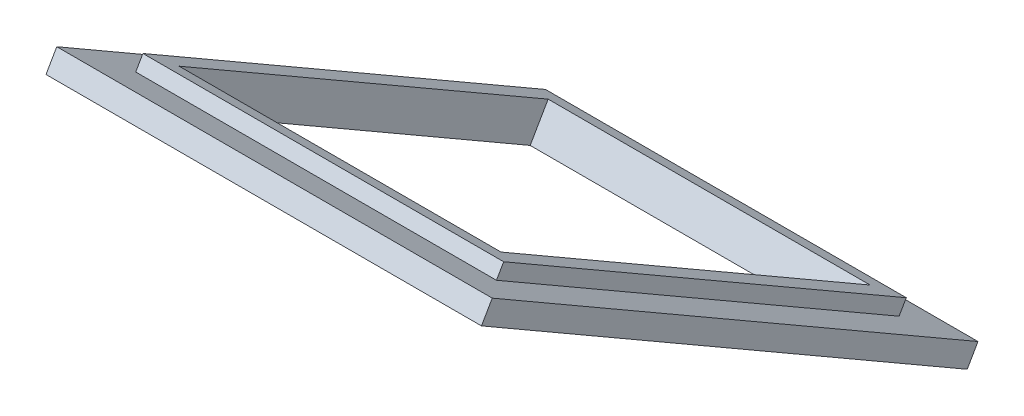
ISO-10303-21;
HEADER;
FILE_DESCRIPTION(('STEP AP214'),'2;1');
FILE_NAME('part.step','',(''),(''),'','','');
FILE_SCHEMA(('AUTOMOTIVE_DESIGN { 1 0 10303 214 1 1 1 1 }'));
ENDSEC;
DATA;
#1=APPLICATION_CONTEXT('core data for automotive mechanical design processes');
#2=APPLICATION_PROTOCOL_DEFINITION('international standard','automotive_design',2000,#1);
#3=PRODUCT_CONTEXT('',#1,'mechanical');
#4=PRODUCT('Part','Part','',(#3));
#5=PRODUCT_RELATED_PRODUCT_CATEGORY('part','',(#4));
#6=PRODUCT_DEFINITION_FORMATION('','',#4);
#7=PRODUCT_DEFINITION_CONTEXT('part definition',#1,'design');
#8=PRODUCT_DEFINITION('design','',#6,#7);
#9=PRODUCT_DEFINITION_SHAPE('','',#8);
#10=(LENGTH_UNIT() NAMED_UNIT(*) SI_UNIT(.MILLI.,.METRE.));
#11=(NAMED_UNIT(*) PLANE_ANGLE_UNIT() SI_UNIT($,.RADIAN.));
#12=(NAMED_UNIT(*) SI_UNIT($,.STERADIAN.) SOLID_ANGLE_UNIT());
#13=UNCERTAINTY_MEASURE_WITH_UNIT(LENGTH_MEASURE(1.E-05),#10,'distance_accuracy_value','');
#14=(GEOMETRIC_REPRESENTATION_CONTEXT(3) GLOBAL_UNCERTAINTY_ASSIGNED_CONTEXT((#13)) GLOBAL_UNIT_ASSIGNED_CONTEXT((#10,
#11,#12)) REPRESENTATION_CONTEXT('',''));
#15=CARTESIAN_POINT('',(0.,0.,0.));
#16=DIRECTION('',(0.,0.,1.));
#17=DIRECTION('',(1.,0.,0.));
#18=AXIS2_PLACEMENT_3D('',#15,#16,#17);
#19=CARTESIAN_POINT('',(0.,-68.9687673215294,39.8191363787617));
#20=DIRECTION('',(0.,0.866025403784439,-0.5));
#21=DIRECTION('',(0.,0.5,0.866025403784439));
#22=AXIS2_PLACEMENT_3D('',#19,#20,#21);
#23=PLANE('',#22);
#24=DIRECTION('',(0.,0.5,0.866025403784439));
#25=VECTOR('',#24,1.);
#26=CARTESIAN_POINT('',(-38.1077910617727,-84.9554244531497,12.129433983612));
#27=LINE('',#26,#25);
#28=CARTESIAN_POINT('',(-38.1077910617727,-84.9554244531497,12.129433983612));
#29=VERTEX_POINT('',#28);
#30=CARTESIAN_POINT('',(-38.1077910617727,-45.926490372918,79.7295307758299));
#31=VERTEX_POINT('',#30);
#32=EDGE_CURVE('E141',#29,#31,#27,.T.);
#33=ORIENTED_EDGE('',*,*,#32,.T.);
#34=DIRECTION('',(1.,0.,0.));
#35=VECTOR('',#34,1.);
#36=CARTESIAN_POINT('',(-38.1077910617727,-45.926490372918,79.7295307758299));
#37=LINE('',#36,#35);
#38=CARTESIAN_POINT('',(22.4922089385485,-45.926490372918,79.7295307758299));
#39=VERTEX_POINT('',#38);
#40=EDGE_CURVE('E218',#31,#39,#37,.T.);
#41=ORIENTED_EDGE('',*,*,#40,.T.);
#42=DIRECTION('',(0.,-0.5,-0.866025403784439));
#43=VECTOR('',#42,1.);
#44=CARTESIAN_POINT('',(22.4922089385485,-45.926490372918,79.7295307758299));
#45=LINE('',#44,#43);
#46=CARTESIAN_POINT('',(22.4922089385485,-84.9554244531497,12.129433983612));
#47=VERTEX_POINT('',#46);
#48=EDGE_CURVE('E221',#39,#47,#45,.T.);
#49=ORIENTED_EDGE('',*,*,#48,.T.);
#50=DIRECTION('',(-1.,0.,0.));
#51=VECTOR('',#50,1.);
#52=CARTESIAN_POINT('',(22.4922089385485,-84.9554244531497,12.129433983612));
#53=LINE('',#52,#51);
#54=EDGE_CURVE('E207',#47,#29,#53,.T.);
#55=ORIENTED_EDGE('',*,*,#54,.T.);
#56=EDGE_LOOP('',(#33,#41,#49,#55));
#57=FACE_BOUND('',#56,.T.);
#58=DIRECTION('',(0.,0.5,0.866025403784439));
#59=VECTOR('',#58,1.);
#60=CARTESIAN_POINT('',(-32.9077910617727,-81.6178178596893,17.9103381791625));
#61=LINE('',#60,#59);
#62=CARTESIAN_POINT('',(-32.9077910617727,-81.6178178596893,17.9103381791624));
#63=VERTEX_POINT('',#62);
#64=CARTESIAN_POINT('',(-32.9077910617727,-49.2678178596937,73.9421818040079));
#65=VERTEX_POINT('',#64);
#66=EDGE_CURVE('E174',#63,#65,#61,.T.);
#67=ORIENTED_EDGE('',*,*,#66,.F.);
#68=DIRECTION('',(-1.,0.,0.));
#69=VECTOR('',#68,1.);
#70=CARTESIAN_POINT('',(-32.9077910617727,-81.6178178596893,17.9103381791625));
#71=LINE('',#70,#69);
#72=CARTESIAN_POINT('',(17.2922089385485,-81.6178178596893,17.9103381791625));
#73=VERTEX_POINT('',#72);
#74=EDGE_CURVE('E58',#73,#63,#71,.T.);
#75=ORIENTED_EDGE('',*,*,#74,.F.);
#76=DIRECTION('',(0.,-0.5,-0.866025403784439));
#77=VECTOR('',#76,1.);
#78=CARTESIAN_POINT('',(17.2922089385485,-81.6178178596893,17.9103381791625));
#79=LINE('',#78,#77);
#80=CARTESIAN_POINT('',(17.2922089385485,-49.2678178596937,73.9421818040079));
#81=VERTEX_POINT('',#80);
#82=EDGE_CURVE('E180',#81,#73,#79,.T.);
#83=ORIENTED_EDGE('',*,*,#82,.F.);
#84=DIRECTION('',(1.,0.,0.));
#85=VECTOR('',#84,1.);
#86=CARTESIAN_POINT('',(-32.9077910617727,-49.2678178596937,73.9421818040079));
#87=LINE('',#86,#85);
#88=EDGE_CURVE('E177',#65,#81,#87,.T.);
#89=ORIENTED_EDGE('',*,*,#88,.F.);
#90=EDGE_LOOP('',(#67,#75,#83,#89));
#91=FACE_BOUND('',#90,.T.);
#92=ADVANCED_FACE('F41',(#57,#91),#23,.T.);
#93=CARTESIAN_POINT('',(-38.1077910617727,-87.5535006645029,13.6294339836119));
#94=DIRECTION('',(-1.,0.,0.));
#95=DIRECTION('',(0.,-1.,0.));
#96=AXIS2_PLACEMENT_3D('',#93,#94,#95);
#97=PLANE('',#96);
#98=ORIENTED_EDGE('',*,*,#32,.F.);
#99=DIRECTION('',(0.,0.866025403784439,-0.5));
#100=VECTOR('',#99,1.);
#101=CARTESIAN_POINT('',(-38.1077910617727,-87.5535006645029,13.6294339836119));
#102=LINE('',#101,#100);
#103=CARTESIAN_POINT('',(-38.1077910617727,-87.5535006645029,13.6294339836119));
#104=VERTEX_POINT('',#103);
#105=EDGE_CURVE('E11',#104,#29,#102,.T.);
#106=ORIENTED_EDGE('',*,*,#105,.F.);
#107=DIRECTION('',(0.,0.5,0.866025403784439));
#108=VECTOR('',#107,1.);
#109=CARTESIAN_POINT('',(-38.1077910617727,-87.5535006645029,13.6294339836119));
#110=LINE('',#109,#108);
#111=CARTESIAN_POINT('',(-38.1077910617727,-48.5245665842711,81.2295307758298));
#112=VERTEX_POINT('',#111);
#113=EDGE_CURVE('E203',#104,#112,#110,.T.);
#114=ORIENTED_EDGE('',*,*,#113,.T.);
#115=DIRECTION('',(0.,0.866025403784439,-0.5));
#116=VECTOR('',#115,1.);
#117=CARTESIAN_POINT('',(-38.1077910617727,-48.5245665842711,81.2295307758298));
#118=LINE('',#117,#116);
#119=EDGE_CURVE('E45',#112,#31,#118,.T.);
#120=ORIENTED_EDGE('',*,*,#119,.T.);
#121=EDGE_LOOP('',(#98,#106,#114,#120));
#122=FACE_BOUND('',#121,.T.);
#123=ADVANCED_FACE('F43',(#122),#97,.T.);
#124=CARTESIAN_POINT('',(22.4922089385485,-87.5535006645029,13.6294339836119));
#125=DIRECTION('',(0.,-0.5,-0.866025403784439));
#126=DIRECTION('',(0.,0.866025403784439,-0.5));
#127=AXIS2_PLACEMENT_3D('',#124,#125,#126);
#128=PLANE('',#127);
#129=ORIENTED_EDGE('',*,*,#54,.F.);
#130=DIRECTION('',(0.,0.866025403784439,-0.5));
#131=VECTOR('',#130,1.);
#132=CARTESIAN_POINT('',(22.4922089385485,-87.5535006645029,13.6294339836119));
#133=LINE('',#132,#131);
#134=CARTESIAN_POINT('',(22.4922089385485,-87.5535006645029,13.6294339836119));
#135=VERTEX_POINT('',#134);
#136=EDGE_CURVE('E50',#135,#47,#133,.T.);
#137=ORIENTED_EDGE('',*,*,#136,.F.);
#138=DIRECTION('',(-1.,0.,0.));
#139=VECTOR('',#138,1.);
#140=CARTESIAN_POINT('',(22.4922089385485,-87.5535006645029,13.6294339836119));
#141=LINE('',#140,#139);
#142=EDGE_CURVE('E213',#135,#104,#141,.T.);
#143=ORIENTED_EDGE('',*,*,#142,.T.);
#144=ORIENTED_EDGE('',*,*,#105,.T.);
#145=EDGE_LOOP('',(#129,#137,#143,#144));
#146=FACE_BOUND('',#145,.T.);
#147=ADVANCED_FACE('F239',(#146),#128,.T.);
#148=CARTESIAN_POINT('',(22.4922089385485,-48.5245665842711,81.2295307758298));
#149=DIRECTION('',(1.,0.,0.));
#150=DIRECTION('',(0.,1.,0.));
#151=AXIS2_PLACEMENT_3D('',#148,#149,#150);
#152=PLANE('',#151);
#153=ORIENTED_EDGE('',*,*,#48,.F.);
#154=DIRECTION('',(0.,0.866025403784439,-0.5));
#155=VECTOR('',#154,1.);
#156=CARTESIAN_POINT('',(22.4922089385485,-48.5245665842711,81.2295307758298));
#157=LINE('',#156,#155);
#158=CARTESIAN_POINT('',(22.4922089385485,-48.5245665842711,81.2295307758298));
#159=VERTEX_POINT('',#158);
#160=EDGE_CURVE('E226',#159,#39,#157,.T.);
#161=ORIENTED_EDGE('',*,*,#160,.F.);
#162=DIRECTION('',(0.,-0.5,-0.866025403784439));
#163=VECTOR('',#162,1.);
#164=CARTESIAN_POINT('',(22.4922089385485,-48.5245665842711,81.2295307758298));
#165=LINE('',#164,#163);
#166=EDGE_CURVE('E210',#159,#135,#165,.T.);
#167=ORIENTED_EDGE('',*,*,#166,.T.);
#168=ORIENTED_EDGE('',*,*,#136,.T.);
#169=EDGE_LOOP('',(#153,#161,#167,#168));
#170=FACE_BOUND('',#169,.T.);
#171=ADVANCED_FACE('F245',(#170),#152,.T.);
#172=CARTESIAN_POINT('',(-38.1077910617727,-48.5245665842711,81.2295307758298));
#173=DIRECTION('',(0.,0.5,0.866025403784439));
#174=DIRECTION('',(0.,-0.866025403784439,0.5));
#175=AXIS2_PLACEMENT_3D('',#172,#173,#174);
#176=PLANE('',#175);
#177=ORIENTED_EDGE('',*,*,#40,.F.);
#178=ORIENTED_EDGE('',*,*,#119,.F.);
#179=DIRECTION('',(1.,0.,0.));
#180=VECTOR('',#179,1.);
#181=CARTESIAN_POINT('',(-38.1077910617727,-48.5245665842711,81.2295307758298));
#182=LINE('',#181,#180);
#183=EDGE_CURVE('E206',#112,#159,#182,.T.);
#184=ORIENTED_EDGE('',*,*,#183,.T.);
#185=ORIENTED_EDGE('',*,*,#160,.T.);
#186=EDGE_LOOP('',(#177,#178,#184,#185));
#187=FACE_BOUND('',#186,.T.);
#188=ADVANCED_FACE('F234',(#187),#176,.T.);
#189=CARTESIAN_POINT('',(0.,-71.5668435328826,41.3191363787616));
#190=DIRECTION('',(0.,0.866025403784439,-0.5));
#191=DIRECTION('',(0.,0.5,0.866025403784439));
#192=AXIS2_PLACEMENT_3D('',#189,#190,#191);
#193=PLANE('',#192);
#194=DIRECTION('',(-1.,-2.70864679891807E-12,-4.69366609071439E-12));
#195=VECTOR('',#194,1.);
#196=CARTESIAN_POINT('',(14.5922089377365,-82.8658940710392,21.7486067693858));
#197=LINE('',#196,#195);
#198=CARTESIAN_POINT('',(14.5922089377365,-82.8658940710392,21.7486067693858));
#199=VERTEX_POINT('',#198);
#200=CARTESIAN_POINT('',(-30.2077910622635,-82.8658940711606,21.7486067691755));
#201=VERTEX_POINT('',#200);
#202=EDGE_CURVE('E196',#199,#201,#197,.T.);
#203=ORIENTED_EDGE('',*,*,#202,.T.);
#204=DIRECTION('',(-5.41766135419901E-12,0.5,0.866025403784439));
#205=VECTOR('',#204,1.);
#206=CARTESIAN_POINT('',(-30.2077910622635,-82.8658940711606,21.7486067691755));
#207=LINE('',#206,#205);
#208=CARTESIAN_POINT('',(-30.2077910625848,-53.2158940711651,73.103913213585));
#209=VERTEX_POINT('',#208);
#210=EDGE_CURVE('E136',#201,#209,#207,.T.);
#211=ORIENTED_EDGE('',*,*,#210,.T.);
#212=DIRECTION('',(1.,2.70864679891807E-12,4.69366609071439E-12));
#213=VECTOR('',#212,1.);
#214=CARTESIAN_POINT('',(-30.2077910625848,-53.2158940711651,73.103913213585));
#215=LINE('',#214,#213);
#216=CARTESIAN_POINT('',(14.5922089374152,-53.2158940710438,73.1039132137953));
#217=VERTEX_POINT('',#216);
#218=EDGE_CURVE('E192',#209,#217,#215,.T.);
#219=ORIENTED_EDGE('',*,*,#218,.T.);
#220=DIRECTION('',(5.41754434081109E-12,-0.5,-0.866025403784439));
#221=VECTOR('',#220,1.);
#222=CARTESIAN_POINT('',(14.5922089374152,-53.2158940710437,73.1039132137953));
#223=LINE('',#222,#221);
#224=EDGE_CURVE('E66',#217,#199,#223,.T.);
#225=ORIENTED_EDGE('',*,*,#224,.T.);
#226=EDGE_LOOP('',(#203,#211,#219,#225));
#227=FACE_BOUND('',#226,.T.);
#228=ORIENTED_EDGE('',*,*,#113,.F.);
#229=ORIENTED_EDGE('',*,*,#142,.F.);
#230=ORIENTED_EDGE('',*,*,#166,.F.);
#231=ORIENTED_EDGE('',*,*,#183,.F.);
#232=EDGE_LOOP('',(#228,#229,#230,#231));
#233=FACE_BOUND('',#232,.T.);
#234=ADVANCED_FACE('F242',(#227,#233),#193,.F.);
#235=CARTESIAN_POINT('',(-30.2077910622635,-82.8658940711606,21.7486067691755));
#236=DIRECTION('',(-1.,-2.70890278820025E-12,-4.69179072847412E-12));
#237=DIRECTION('',(-4.69179072847412E-12,0.,1.));
#238=AXIS2_PLACEMENT_3D('',#235,#236,#237);
#239=PLANE('',#238);
#240=DIRECTION('',(0.,0.866025403784439,-0.5));
#241=VECTOR('',#240,1.);
#242=CARTESIAN_POINT('',(-30.2077910622635,-82.8658940711606,21.7486067691755));
#243=LINE('',#242,#241);
#244=CARTESIAN_POINT('',(-30.2077910625848,-78.5357670521173,19.2486067693859));
#245=VERTEX_POINT('',#244);
#246=EDGE_CURVE('E131',#201,#245,#243,.T.);
#247=ORIENTED_EDGE('',*,*,#246,.T.);
#248=DIRECTION('',(0.,0.5,0.866025403784439));
#249=VECTOR('',#248,1.);
#250=CARTESIAN_POINT('',(-30.2077910625848,-78.5357670521173,19.2486067693859));
#251=LINE('',#250,#249);
#252=CARTESIAN_POINT('',(-30.2077910625848,-48.8857670522432,70.6039132135851));
#253=VERTEX_POINT('',#252);
#254=EDGE_CURVE('E134',#245,#253,#251,.T.);
#255=ORIENTED_EDGE('',*,*,#254,.T.);
#256=DIRECTION('',(0.,0.866025403784439,-0.5));
#257=VECTOR('',#256,1.);
#258=CARTESIAN_POINT('',(-30.2077910625848,-53.2158940711651,73.103913213585));
#259=LINE('',#258,#257);
#260=EDGE_CURVE('E197',#209,#253,#259,.T.);
#261=ORIENTED_EDGE('',*,*,#260,.F.);
#262=ORIENTED_EDGE('',*,*,#210,.F.);
#263=EDGE_LOOP('',(#247,#255,#261,#262));
#264=FACE_BOUND('',#263,.T.);
#265=ADVANCED_FACE('F133',(#264),#239,.F.);
#266=CARTESIAN_POINT('',(14.5922089377365,-82.8658940710392,21.7486067693858));
#267=DIRECTION('',(5.41915747089929E-12,-0.5,-0.866025403784439));
#268=DIRECTION('',(0.,0.866025403784439,-0.5));
#269=AXIS2_PLACEMENT_3D('',#266,#267,#268);
#270=PLANE('',#269);
#271=DIRECTION('',(0.,0.866025403784439,-0.5));
#272=VECTOR('',#271,1.);
#273=CARTESIAN_POINT('',(14.5922089377365,-82.8658940710392,21.7486067693858));
#274=LINE('',#273,#272);
#275=CARTESIAN_POINT('',(14.5922089374152,-78.5357670521173,19.2486067693859));
#276=VERTEX_POINT('',#275);
#277=EDGE_CURVE('E142',#199,#276,#274,.T.);
#278=ORIENTED_EDGE('',*,*,#277,.T.);
#279=DIRECTION('',(-1.,0.,0.));
#280=VECTOR('',#279,1.);
#281=CARTESIAN_POINT('',(14.5922089374152,-78.5357670521173,19.2486067693859));
#282=LINE('',#281,#280);
#283=EDGE_CURVE('E150',#276,#245,#282,.T.);
#284=ORIENTED_EDGE('',*,*,#283,.T.);
#285=ORIENTED_EDGE('',*,*,#246,.F.);
#286=ORIENTED_EDGE('',*,*,#202,.F.);
#287=EDGE_LOOP('',(#278,#284,#285,#286));
#288=FACE_BOUND('',#287,.T.);
#289=ADVANCED_FACE('F156',(#288),#270,.F.);
#290=CARTESIAN_POINT('',(14.5922089374152,-53.2158940710437,73.1039132137953));
#291=DIRECTION('',(1.,2.70884428150628E-12,4.6916893919076E-12));
#292=DIRECTION('',(4.6916893919076E-12,0.,-1.));
#293=AXIS2_PLACEMENT_3D('',#290,#291,#292);
#294=PLANE('',#293);
#295=DIRECTION('',(0.,0.866025403784439,-0.5));
#296=VECTOR('',#295,1.);
#297=CARTESIAN_POINT('',(14.5922089374152,-53.2158940710437,73.1039132137953));
#298=LINE('',#297,#296);
#299=CARTESIAN_POINT('',(14.5922089374152,-48.8857670522432,70.6039132135851));
#300=VERTEX_POINT('',#299);
#301=EDGE_CURVE('E200',#217,#300,#298,.T.);
#302=ORIENTED_EDGE('',*,*,#301,.T.);
#303=DIRECTION('',(0.,-0.5,-0.866025403784439));
#304=VECTOR('',#303,1.);
#305=CARTESIAN_POINT('',(14.5922089374152,-48.8857670522432,70.6039132135851));
#306=LINE('',#305,#304);
#307=EDGE_CURVE('E157',#300,#276,#306,.T.);
#308=ORIENTED_EDGE('',*,*,#307,.T.);
#309=ORIENTED_EDGE('',*,*,#277,.F.);
#310=ORIENTED_EDGE('',*,*,#224,.F.);
#311=EDGE_LOOP('',(#302,#308,#309,#310));
#312=FACE_BOUND('',#311,.T.);
#313=ADVANCED_FACE('F268',(#312),#294,.F.);
#314=CARTESIAN_POINT('',(-30.2077910625848,-53.2158940711651,73.103913213585));
#315=DIRECTION('',(-5.41915747089929E-12,0.5,0.866025403784439));
#316=DIRECTION('',(0.,-0.866025403784439,0.5));
#317=AXIS2_PLACEMENT_3D('',#314,#315,#316);
#318=PLANE('',#317);
#319=ORIENTED_EDGE('',*,*,#260,.T.);
#320=DIRECTION('',(1.,0.,0.));
#321=VECTOR('',#320,1.);
#322=CARTESIAN_POINT('',(-30.2077910625848,-48.8857670522432,70.6039132135851));
#323=LINE('',#322,#321);
#324=EDGE_CURVE('E153',#253,#300,#323,.T.);
#325=ORIENTED_EDGE('',*,*,#324,.T.);
#326=ORIENTED_EDGE('',*,*,#301,.F.);
#327=ORIENTED_EDGE('',*,*,#218,.F.);
#328=EDGE_LOOP('',(#319,#325,#326,#327));
#329=FACE_BOUND('',#328,.T.);
#330=ADVANCED_FACE('F264',(#329),#318,.F.);
#331=CARTESIAN_POINT('',(-32.9077910617727,-8.96611180744708,-24.0351438671851));
#332=DIRECTION('',(0.,0.5,0.866025403784439));
#333=DIRECTION('',(0.,-0.866025403784439,0.5));
#334=AXIS2_PLACEMENT_3D('',#331,#332,#333);
#335=PLANE('',#334);
#336=DIRECTION('',(-1.,0.,0.));
#337=VECTOR('',#336,1.);
#338=CARTESIAN_POINT('',(-32.9077910617727,-79.8857670521204,16.9103381791625));
#339=LINE('',#338,#337);
#340=CARTESIAN_POINT('',(17.2922089385485,-79.8857670521204,16.9103381791625));
#341=VERTEX_POINT('',#340);
#342=CARTESIAN_POINT('',(-32.9077910617727,-79.8857670521204,16.9103381791625));
#343=VERTEX_POINT('',#342);
#344=EDGE_CURVE('E162',#341,#343,#339,.T.);
#345=ORIENTED_EDGE('',*,*,#344,.F.);
#346=DIRECTION('',(0.,-0.866025403784439,0.5));
#347=VECTOR('',#346,1.);
#348=CARTESIAN_POINT('',(17.2922089385485,-8.96611180744708,-24.0351438671851));
#349=LINE('',#348,#347);
#350=EDGE_CURVE('E186',#341,#73,#349,.T.);
#351=ORIENTED_EDGE('',*,*,#350,.T.);
#352=ORIENTED_EDGE('',*,*,#74,.T.);
#353=DIRECTION('',(0.,-0.866025403784439,0.5));
#354=VECTOR('',#353,1.);
#355=CARTESIAN_POINT('',(-32.9077910617727,-8.96611180744708,-24.0351438671851));
#356=LINE('',#355,#354);
#357=EDGE_CURVE('E184',#343,#63,#356,.T.);
#358=ORIENTED_EDGE('',*,*,#357,.F.);
#359=EDGE_LOOP('',(#345,#351,#352,#358));
#360=FACE_BOUND('',#359,.T.);
#361=ADVANCED_FACE('F267',(#360),#335,.F.);
#362=CARTESIAN_POINT('',(17.2922089385485,-8.96611180744708,-24.0351438671851));
#363=DIRECTION('',(-1.,0.,0.));
#364=DIRECTION('',(0.,0.,1.));
#365=AXIS2_PLACEMENT_3D('',#362,#363,#364);
#366=PLANE('',#365);
#367=DIRECTION('',(0.,-0.5,-0.866025403784439));
#368=VECTOR('',#367,1.);
#369=CARTESIAN_POINT('',(17.2922089385485,-79.8857670521204,16.9103381791625));
#370=LINE('',#369,#368);
#371=CARTESIAN_POINT('',(17.2922089385485,-47.5357670521249,72.9421818040079));
#372=VERTEX_POINT('',#371);
#373=EDGE_CURVE('E165',#372,#341,#370,.T.);
#374=ORIENTED_EDGE('',*,*,#373,.F.);
#375=DIRECTION('',(0.,-0.866025403784439,0.5));
#376=VECTOR('',#375,1.);
#377=CARTESIAN_POINT('',(17.2922089385485,23.3838881925484,31.9966997576603));
#378=LINE('',#377,#376);
#379=EDGE_CURVE('E188',#372,#81,#378,.T.);
#380=ORIENTED_EDGE('',*,*,#379,.T.);
#381=ORIENTED_EDGE('',*,*,#82,.T.);
#382=ORIENTED_EDGE('',*,*,#350,.F.);
#383=EDGE_LOOP('',(#374,#380,#381,#382));
#384=FACE_BOUND('',#383,.T.);
#385=ADVANCED_FACE('F281',(#384),#366,.F.);
#386=CARTESIAN_POINT('',(-32.9077910617727,23.3838881925484,31.9966997576603));
#387=DIRECTION('',(0.,-0.5,-0.866025403784439));
#388=DIRECTION('',(0.,0.866025403784439,-0.5));
#389=AXIS2_PLACEMENT_3D('',#386,#387,#388);
#390=PLANE('',#389);
#391=DIRECTION('',(1.,0.,0.));
#392=VECTOR('',#391,1.);
#393=CARTESIAN_POINT('',(-32.9077910617727,-47.5357670521249,72.9421818040079));
#394=LINE('',#393,#392);
#395=CARTESIAN_POINT('',(-32.9077910617727,-47.5357670521249,72.9421818040079));
#396=VERTEX_POINT('',#395);
#397=EDGE_CURVE('E168',#396,#372,#394,.T.);
#398=ORIENTED_EDGE('',*,*,#397,.F.);
#399=DIRECTION('',(0.,-0.866025403784439,0.5));
#400=VECTOR('',#399,1.);
#401=CARTESIAN_POINT('',(-32.9077910617727,23.3838881925484,31.9966997576603));
#402=LINE('',#401,#400);
#403=EDGE_CURVE('E154',#396,#65,#402,.T.);
#404=ORIENTED_EDGE('',*,*,#403,.T.);
#405=ORIENTED_EDGE('',*,*,#88,.T.);
#406=ORIENTED_EDGE('',*,*,#379,.F.);
#407=EDGE_LOOP('',(#398,#404,#405,#406));
#408=FACE_BOUND('',#407,.T.);
#409=ADVANCED_FACE('F277',(#408),#390,.F.);
#410=CARTESIAN_POINT('',(-32.9077910617727,-8.96611180744708,-24.0351438671851));
#411=DIRECTION('',(1.,0.,0.));
#412=DIRECTION('',(0.,0.,-1.));
#413=AXIS2_PLACEMENT_3D('',#410,#411,#412);
#414=PLANE('',#413);
#415=DIRECTION('',(0.,0.5,0.866025403784439));
#416=VECTOR('',#415,1.);
#417=CARTESIAN_POINT('',(-32.9077910617727,-79.8857670521204,16.9103381791625));
#418=LINE('',#417,#416);
#419=EDGE_CURVE('E171',#343,#396,#418,.T.);
#420=ORIENTED_EDGE('',*,*,#419,.F.);
#421=ORIENTED_EDGE('',*,*,#357,.T.);
#422=ORIENTED_EDGE('',*,*,#66,.T.);
#423=ORIENTED_EDGE('',*,*,#403,.F.);
#424=EDGE_LOOP('',(#420,#421,#422,#423));
#425=FACE_BOUND('',#424,.T.);
#426=ADVANCED_FACE('F274',(#425),#414,.F.);
#427=CARTESIAN_POINT('',(22.0922089386204,-85.7733736455283,6.71270442440255));
#428=DIRECTION('',(0.,0.866025403784439,-0.5));
#429=DIRECTION('',(0.,0.5,0.866025403784439));
#430=AXIS2_PLACEMENT_3D('',#427,#428,#429);
#431=PLANE('',#430);
#432=ORIENTED_EDGE('',*,*,#324,.F.);
#433=ORIENTED_EDGE('',*,*,#254,.F.);
#434=ORIENTED_EDGE('',*,*,#283,.F.);
#435=ORIENTED_EDGE('',*,*,#307,.F.);
#436=EDGE_LOOP('',(#432,#433,#434,#435));
#437=FACE_BOUND('',#436,.T.);
#438=ORIENTED_EDGE('',*,*,#344,.T.);
#439=ORIENTED_EDGE('',*,*,#419,.T.);
#440=ORIENTED_EDGE('',*,*,#397,.T.);
#441=ORIENTED_EDGE('',*,*,#373,.T.);
#442=EDGE_LOOP('',(#438,#439,#440,#441));
#443=FACE_BOUND('',#442,.T.);
#444=ADVANCED_FACE('F147',(#437,#443),#431,.T.);
#445=CLOSED_SHELL('',(#92,#123,#147,#171,#188,#234,#265,#289,#313,#330,#361,#385,#409,#426,#444));
#446=MANIFOLD_SOLID_BREP('B2',#445);
#447=ADVANCED_BREP_SHAPE_REPRESENTATION('',(#18,#446),#14);
#448=SHAPE_DEFINITION_REPRESENTATION(#9,#447);
ENDSEC;
END-ISO-10303-21;
